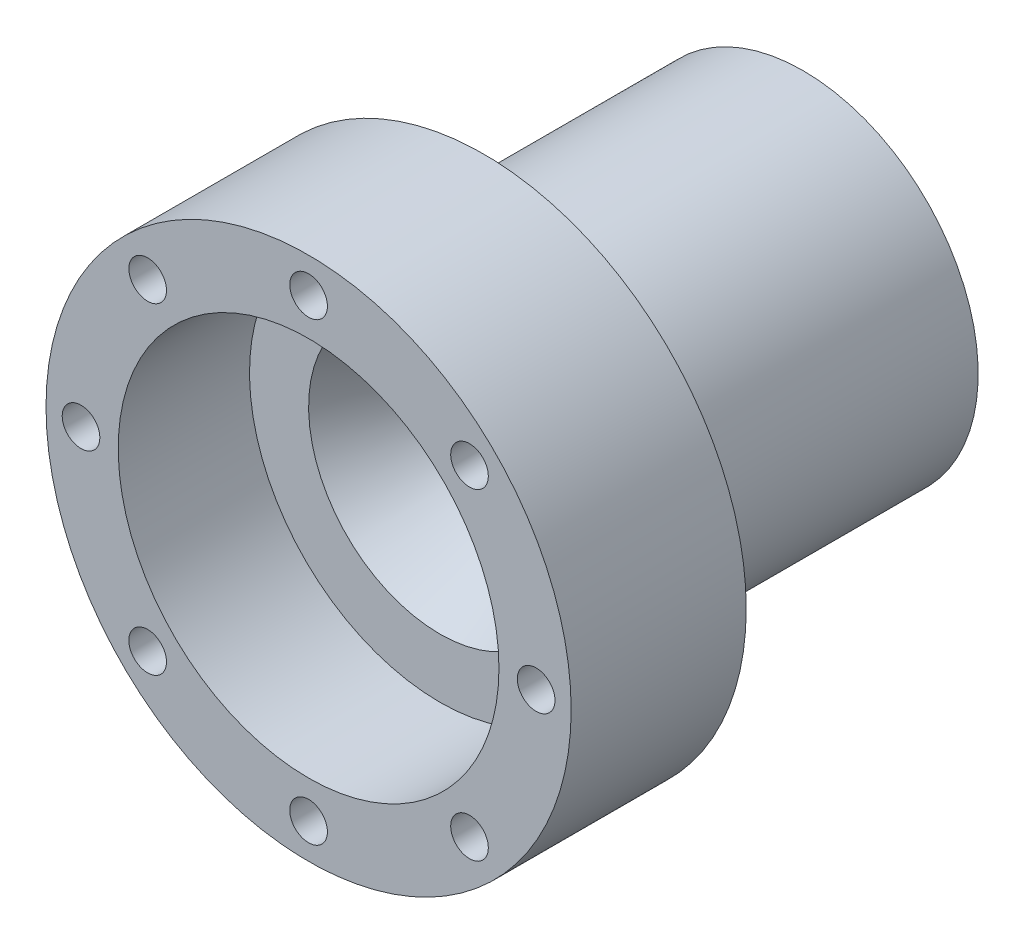
ISO-10303-21;
HEADER;
FILE_DESCRIPTION(('STEP AP214'),'2;1');
FILE_NAME('part.step','',(''),(''),'','','');
FILE_SCHEMA(('AUTOMOTIVE_DESIGN { 1 0 10303 214 1 1 1 1 }'));
ENDSEC;
DATA;
#1=APPLICATION_CONTEXT('core data for automotive mechanical design processes');
#2=APPLICATION_PROTOCOL_DEFINITION('international standard','automotive_design',2000,#1);
#3=PRODUCT_CONTEXT('',#1,'mechanical');
#4=PRODUCT('Part','Part','',(#3));
#5=PRODUCT_RELATED_PRODUCT_CATEGORY('part','',(#4));
#6=PRODUCT_DEFINITION_FORMATION('','',#4);
#7=PRODUCT_DEFINITION_CONTEXT('part definition',#1,'design');
#8=PRODUCT_DEFINITION('design','',#6,#7);
#9=PRODUCT_DEFINITION_SHAPE('','',#8);
#10=(LENGTH_UNIT() NAMED_UNIT(*) SI_UNIT(.MILLI.,.METRE.));
#11=(NAMED_UNIT(*) PLANE_ANGLE_UNIT() SI_UNIT($,.RADIAN.));
#12=(NAMED_UNIT(*) SI_UNIT($,.STERADIAN.) SOLID_ANGLE_UNIT());
#13=UNCERTAINTY_MEASURE_WITH_UNIT(LENGTH_MEASURE(1.E-05),#10,'distance_accuracy_value','');
#14=(GEOMETRIC_REPRESENTATION_CONTEXT(3) GLOBAL_UNCERTAINTY_ASSIGNED_CONTEXT((#13)) GLOBAL_UNIT_ASSIGNED_CONTEXT((#10,
#11,#12)) REPRESENTATION_CONTEXT('',''));
#15=CARTESIAN_POINT('',(0.,0.,0.));
#16=DIRECTION('',(0.,0.,1.));
#17=DIRECTION('',(1.,0.,0.));
#18=AXIS2_PLACEMENT_3D('',#15,#16,#17);
#19=CARTESIAN_POINT('',(0.,0.,15.1713296347436));
#20=DIRECTION('',(0.,0.,1.));
#21=DIRECTION('',(1.,0.,0.));
#22=AXIS2_PLACEMENT_3D('',#19,#20,#21);
#23=PLANE('',#22);
#24=CARTESIAN_POINT('',(18.38477631085,18.3847763108505,15.1713296347436));
#25=DIRECTION('',(0.,0.,-1.));
#26=DIRECTION('',(-1.,0.,0.));
#27=AXIS2_PLACEMENT_3D('',#24,#25,#26);
#28=CIRCLE('',#27,2.15);
#29=CARTESIAN_POINT('',(16.23477631085,18.3847763108505,15.1713296347436));
#30=VERTEX_POINT('',#29);
#31=EDGE_CURVE('E117',#30,#30,#28,.T.);
#32=ORIENTED_EDGE('',*,*,#31,.F.);
#33=EDGE_LOOP('',(#32));
#34=FACE_BOUND('',#33,.T.);
#35=CARTESIAN_POINT('',(-26.,0.,15.1713296347436));
#36=DIRECTION('',(0.,0.,-1.));
#37=DIRECTION('',(-1.,0.,0.));
#38=AXIS2_PLACEMENT_3D('',#35,#36,#37);
#39=CIRCLE('',#38,2.15);
#40=CARTESIAN_POINT('',(-28.15,0.,15.1713296347436));
#41=VERTEX_POINT('',#40);
#42=EDGE_CURVE('E87',#41,#41,#39,.T.);
#43=ORIENTED_EDGE('',*,*,#42,.F.);
#44=EDGE_LOOP('',(#43));
#45=FACE_BOUND('',#44,.T.);
#46=CARTESIAN_POINT('',(-18.3847763108503,18.3847763108502,15.1713296347436));
#47=DIRECTION('',(0.,0.,-1.));
#48=DIRECTION('',(-1.,0.,0.));
#49=AXIS2_PLACEMENT_3D('',#46,#47,#48);
#50=CIRCLE('',#49,2.15);
#51=CARTESIAN_POINT('',(-20.5347763108503,18.3847763108502,15.1713296347436));
#52=VERTEX_POINT('',#51);
#53=EDGE_CURVE('E81',#52,#52,#50,.T.);
#54=ORIENTED_EDGE('',*,*,#53,.F.);
#55=EDGE_LOOP('',(#54));
#56=FACE_BOUND('',#55,.T.);
#57=CARTESIAN_POINT('',(0.,26.,15.1713296347436));
#58=DIRECTION('',(0.,0.,-1.));
#59=DIRECTION('',(-1.,0.,0.));
#60=AXIS2_PLACEMENT_3D('',#57,#58,#59);
#61=CIRCLE('',#60,2.15);
#62=CARTESIAN_POINT('',(-2.15,26.,15.1713296347436));
#63=VERTEX_POINT('',#62);
#64=EDGE_CURVE('E75',#63,#63,#61,.T.);
#65=ORIENTED_EDGE('',*,*,#64,.F.);
#66=EDGE_LOOP('',(#65));
#67=FACE_BOUND('',#66,.T.);
#68=CARTESIAN_POINT('',(0.,0.,15.1713296347436));
#69=DIRECTION('',(0.,0.,1.));
#70=DIRECTION('',(1.,0.,0.));
#71=AXIS2_PLACEMENT_3D('',#68,#69,#70);
#72=CIRCLE('',#71,20.);
#73=CARTESIAN_POINT('',(20.,0.,15.1713296347436));
#74=VERTEX_POINT('',#73);
#75=EDGE_CURVE('E63',#74,#74,#72,.T.);
#76=ORIENTED_EDGE('',*,*,#75,.T.);
#77=EDGE_LOOP('',(#76));
#78=FACE_BOUND('',#77,.T.);
#79=CARTESIAN_POINT('',(0.,0.,15.1713296347436));
#80=DIRECTION('',(0.,0.,1.));
#81=DIRECTION('',(1.,0.,0.));
#82=AXIS2_PLACEMENT_3D('',#79,#80,#81);
#83=CIRCLE('',#82,30.);
#84=CARTESIAN_POINT('',(30.,0.,15.1713296347436));
#85=VERTEX_POINT('',#84);
#86=EDGE_CURVE('E60',#85,#85,#83,.T.);
#87=ORIENTED_EDGE('',*,*,#86,.F.);
#88=EDGE_LOOP('',(#87));
#89=FACE_BOUND('',#88,.T.);
#90=CARTESIAN_POINT('',(-18.3847763108501,-18.3847763108503,15.1713296347436));
#91=DIRECTION('',(0.,0.,-1.));
#92=DIRECTION('',(-1.,0.,0.));
#93=AXIS2_PLACEMENT_3D('',#90,#91,#92);
#94=CIRCLE('',#93,2.15);
#95=CARTESIAN_POINT('',(-20.5347763108501,-18.3847763108503,15.1713296347436));
#96=VERTEX_POINT('',#95);
#97=EDGE_CURVE('E93',#96,#96,#94,.T.);
#98=ORIENTED_EDGE('',*,*,#97,.F.);
#99=EDGE_LOOP('',(#98));
#100=FACE_BOUND('',#99,.T.);
#101=CARTESIAN_POINT('',(0.,-26.,15.1713296347436));
#102=DIRECTION('',(0.,0.,-1.));
#103=DIRECTION('',(-1.,0.,0.));
#104=AXIS2_PLACEMENT_3D('',#101,#102,#103);
#105=CIRCLE('',#104,2.15);
#106=CARTESIAN_POINT('',(-2.15,-26.,15.1713296347436));
#107=VERTEX_POINT('',#106);
#108=EDGE_CURVE('E99',#107,#107,#105,.T.);
#109=ORIENTED_EDGE('',*,*,#108,.F.);
#110=EDGE_LOOP('',(#109));
#111=FACE_BOUND('',#110,.T.);
#112=CARTESIAN_POINT('',(18.3847763108504,-18.3847763108501,15.1713296347436));
#113=DIRECTION('',(0.,0.,-1.));
#114=DIRECTION('',(-1.,0.,0.));
#115=AXIS2_PLACEMENT_3D('',#112,#113,#114);
#116=CIRCLE('',#115,2.15);
#117=CARTESIAN_POINT('',(16.2347763108504,-18.3847763108501,15.1713296347436));
#118=VERTEX_POINT('',#117);
#119=EDGE_CURVE('E105',#118,#118,#116,.T.);
#120=ORIENTED_EDGE('',*,*,#119,.F.);
#121=EDGE_LOOP('',(#120));
#122=FACE_BOUND('',#121,.T.);
#123=CARTESIAN_POINT('',(26.,2.72335544429764E-13,15.1713296347436));
#124=DIRECTION('',(0.,0.,-1.));
#125=DIRECTION('',(-1.,0.,0.));
#126=AXIS2_PLACEMENT_3D('',#123,#124,#125);
#127=CIRCLE('',#126,2.15);
#128=CARTESIAN_POINT('',(23.85,2.72335544429764E-13,15.1713296347436));
#129=VERTEX_POINT('',#128);
#130=EDGE_CURVE('E111',#129,#129,#127,.T.);
#131=ORIENTED_EDGE('',*,*,#130,.F.);
#132=EDGE_LOOP('',(#131));
#133=FACE_BOUND('',#132,.T.);
#134=ADVANCED_FACE('F34',(#34,#45,#56,#67,#78,#89,#100,#111,#122,#133),#23,.F.);
#135=CARTESIAN_POINT('',(0.,15.,20.1713296347436));
#136=DIRECTION('',(0.,0.,1.));
#137=DIRECTION('',(0.,-1.,0.));
#138=AXIS2_PLACEMENT_3D('',#135,#136,#137);
#139=PLANE('',#138);
#140=CARTESIAN_POINT('',(0.,0.,20.1713296347436));
#141=DIRECTION('',(0.,0.,-1.));
#142=DIRECTION('',(0.,1.,0.));
#143=AXIS2_PLACEMENT_3D('',#140,#141,#142);
#144=CIRCLE('',#143,15.);
#145=CARTESIAN_POINT('',(0.,-15.,20.1713296347436));
#146=VERTEX_POINT('',#145);
#147=EDGE_CURVE('E57',#146,#146,#144,.T.);
#148=ORIENTED_EDGE('',*,*,#147,.T.);
#149=EDGE_LOOP('',(#148));
#150=FACE_BOUND('',#149,.T.);
#151=CARTESIAN_POINT('',(0.,0.,20.1713296347436));
#152=DIRECTION('',(0.,0.,1.));
#153=DIRECTION('',(0.,-1.,0.));
#154=AXIS2_PLACEMENT_3D('',#151,#152,#153);
#155=CIRCLE('',#154,21.75);
#156=CARTESIAN_POINT('',(0.,-21.75,20.1713296347436));
#157=VERTEX_POINT('',#156);
#158=EDGE_CURVE('E10',#157,#157,#155,.F.);
#159=ORIENTED_EDGE('',*,*,#158,.F.);
#160=EDGE_LOOP('',(#159));
#161=FACE_BOUND('',#160,.T.);
#162=ADVANCED_FACE('F126',(#150,#161),#139,.T.);
#163=CARTESIAN_POINT('',(0.,0.,0.));
#164=DIRECTION('',(0.,0.,-1.));
#165=DIRECTION('',(0.,1.,0.));
#166=AXIS2_PLACEMENT_3D('',#163,#164,#165);
#167=CYLINDRICAL_SURFACE('',#166,20.);
#168=CARTESIAN_POINT('',(0.,0.,-21.3286703652564));
#169=DIRECTION('',(0.,0.,-1.));
#170=DIRECTION('',(0.,1.,0.));
#171=AXIS2_PLACEMENT_3D('',#168,#169,#170);
#172=CIRCLE('',#171,20.);
#173=CARTESIAN_POINT('',(0.,20.,-21.3286703652564));
#174=VERTEX_POINT('',#173);
#175=EDGE_CURVE('E41',#174,#174,#172,.T.);
#176=ORIENTED_EDGE('',*,*,#175,.F.);
#177=EDGE_LOOP('',(#176));
#178=FACE_BOUND('',#177,.T.);
#179=ORIENTED_EDGE('',*,*,#75,.F.);
#180=EDGE_LOOP('',(#179));
#181=FACE_BOUND('',#180,.T.);
#182=ADVANCED_FACE('F36',(#178,#181),#167,.T.);
#183=CARTESIAN_POINT('',(0.,20.,-21.3286703652564));
#184=DIRECTION('',(0.,0.,-1.));
#185=DIRECTION('',(0.,1.,0.));
#186=AXIS2_PLACEMENT_3D('',#183,#184,#185);
#187=PLANE('',#186);
#188=ORIENTED_EDGE('',*,*,#175,.T.);
#189=EDGE_LOOP('',(#188));
#190=FACE_BOUND('',#189,.T.);
#191=CARTESIAN_POINT('',(0.,0.,-21.3286703652564));
#192=DIRECTION('',(0.,0.,-1.));
#193=DIRECTION('',(0.,1.,0.));
#194=AXIS2_PLACEMENT_3D('',#191,#192,#193);
#195=CIRCLE('',#194,10.285);
#196=CARTESIAN_POINT('',(0.,10.285,-21.3286703652564));
#197=VERTEX_POINT('',#196);
#198=EDGE_CURVE('E45',#197,#197,#195,.T.);
#199=ORIENTED_EDGE('',*,*,#198,.F.);
#200=EDGE_LOOP('',(#199));
#201=FACE_BOUND('',#200,.T.);
#202=ADVANCED_FACE('F203',(#190,#201),#187,.T.);
#203=CARTESIAN_POINT('',(0.,0.,0.));
#204=DIRECTION('',(0.,0.,-1.));
#205=DIRECTION('',(0.,1.,0.));
#206=AXIS2_PLACEMENT_3D('',#203,#204,#205);
#207=CONICAL_SURFACE('',#206,4.57,0.261799387799147);
#208=ORIENTED_EDGE('',*,*,#198,.T.);
#209=EDGE_LOOP('',(#208));
#210=FACE_BOUND('',#209,.T.);
#211=CARTESIAN_POINT('',(0.,0.,0.));
#212=DIRECTION('',(0.,0.,-1.));
#213=DIRECTION('',(0.,1.,0.));
#214=AXIS2_PLACEMENT_3D('',#211,#212,#213);
#215=CIRCLE('',#214,4.57);
#216=CARTESIAN_POINT('',(0.,4.57,0.));
#217=VERTEX_POINT('',#216);
#218=EDGE_CURVE('E49',#217,#217,#215,.T.);
#219=ORIENTED_EDGE('',*,*,#218,.F.);
#220=EDGE_LOOP('',(#219));
#221=FACE_BOUND('',#220,.T.);
#222=ADVANCED_FACE('F200',(#210,#221),#207,.F.);
#223=CARTESIAN_POINT('',(0.,0.,0.));
#224=DIRECTION('',(0.,0.,-1.));
#225=DIRECTION('',(0.,1.,0.));
#226=AXIS2_PLACEMENT_3D('',#223,#224,#225);
#227=CYLINDRICAL_SURFACE('',#226,4.57);
#228=ORIENTED_EDGE('',*,*,#218,.T.);
#229=EDGE_LOOP('',(#228));
#230=FACE_BOUND('',#229,.T.);
#231=CARTESIAN_POINT('',(0.,0.,2.10603971180046));
#232=DIRECTION('',(0.,0.,-1.));
#233=DIRECTION('',(0.,1.,0.));
#234=AXIS2_PLACEMENT_3D('',#231,#232,#233);
#235=CIRCLE('',#234,4.57);
#236=CARTESIAN_POINT('',(0.,-4.57,2.10603971180046));
#237=VERTEX_POINT('',#236);
#238=EDGE_CURVE('E54',#237,#237,#235,.T.);
#239=ORIENTED_EDGE('',*,*,#238,.F.);
#240=EDGE_LOOP('',(#239));
#241=FACE_BOUND('',#240,.T.);
#242=ADVANCED_FACE('F196',(#230,#241),#227,.F.);
#243=CARTESIAN_POINT('',(0.,0.,20.1713296347436));
#244=DIRECTION('',(0.,0.,1.));
#245=DIRECTION('',(0.,-1.,0.));
#246=AXIS2_PLACEMENT_3D('',#243,#244,#245);
#247=CONICAL_SURFACE('',#246,15.,0.523598775598304);
#248=CARTESIAN_POINT('',(0.,-4.57,2.10603971180046));
#249=CARTESIAN_POINT('',(0.,-4.67864583333333,2.29421981516445));
#250=CARTESIAN_POINT('',(0.,-4.78729166666667,2.48239991852844));
#251=CARTESIAN_POINT('',(0.,-5.00458333333333,2.85876012525643));
#252=CARTESIAN_POINT('',(0.,-5.11322916666667,3.04694022862042));
#253=CARTESIAN_POINT('',(0.,-5.33052083333333,3.4233004353484));
#254=CARTESIAN_POINT('',(0.,-5.43916666666667,3.61148053871239));
#255=CARTESIAN_POINT('',(0.,-5.65645833333333,3.98784074544037));
#256=CARTESIAN_POINT('',(0.,-5.76510416666667,4.17602084880436));
#257=CARTESIAN_POINT('',(0.,-5.98239583333333,4.55238105553235));
#258=CARTESIAN_POINT('',(0.,-6.09104166666667,4.74056115889634));
#259=CARTESIAN_POINT('',(0.,-6.30833333333334,5.11692136562432));
#260=CARTESIAN_POINT('',(0.,-6.41697916666667,5.30510146898832));
#261=CARTESIAN_POINT('',(0.,-6.63427083333333,5.6814616757163));
#262=CARTESIAN_POINT('',(0.,-6.74291666666667,5.86964177908029));
#263=CARTESIAN_POINT('',(0.,-6.96020833333333,6.24600198580827));
#264=CARTESIAN_POINT('',(0.,-7.06885416666667,6.43418208917226));
#265=CARTESIAN_POINT('',(0.,-7.28614583333333,6.81054229590025));
#266=CARTESIAN_POINT('',(0.,-7.39479166666667,6.99872239926424));
#267=CARTESIAN_POINT('',(0.,-7.61208333333333,7.37508260599222));
#268=CARTESIAN_POINT('',(0.,-7.72072916666667,7.56326270935621));
#269=CARTESIAN_POINT('',(0.,-7.93802083333333,7.9396229160842));
#270=CARTESIAN_POINT('',(0.,-8.04666666666667,8.12780301944819));
#271=CARTESIAN_POINT('',(0.,-8.26395833333333,8.50416322617617));
#272=CARTESIAN_POINT('',(0.,-8.37260416666667,8.69234332954017));
#273=CARTESIAN_POINT('',(0.,-8.58989583333333,9.06870353626815));
#274=CARTESIAN_POINT('',(0.,-8.69854166666667,9.25688363963214));
#275=CARTESIAN_POINT('',(0.,-8.91583333333334,9.63324384636012));
#276=CARTESIAN_POINT('',(0.,-9.02447916666667,9.82142394972411));
#277=CARTESIAN_POINT('',(0.,-9.24177083333333,10.1977841564521));
#278=CARTESIAN_POINT('',(0.,-9.35041666666667,10.3859642598161));
#279=CARTESIAN_POINT('',(0.,-9.56770833333333,10.7623244665441));
#280=CARTESIAN_POINT('',(0.,-9.67635416666666,10.9505045699081));
#281=CARTESIAN_POINT('',(0.,-9.89364583333333,11.326864776636));
#282=CARTESIAN_POINT('',(0.,-10.0022916666667,11.51504488));
#283=CARTESIAN_POINT('',(0.,-10.2195833333333,11.891405086728));
#284=CARTESIAN_POINT('',(0.,-10.3282291666667,12.079585190092));
#285=CARTESIAN_POINT('',(0.,-10.5455208333333,12.45594539682));
#286=CARTESIAN_POINT('',(0.,-10.6541666666667,12.644125500184));
#287=CARTESIAN_POINT('',(0.,-10.8714583333333,13.020485706912));
#288=CARTESIAN_POINT('',(0.,-10.9801041666667,13.208665810276));
#289=CARTESIAN_POINT('',(0.,-11.1973958333333,13.5850260170039));
#290=CARTESIAN_POINT('',(0.,-11.3060416666667,13.7732061203679));
#291=CARTESIAN_POINT('',(0.,-11.5233333333333,14.1495663270959));
#292=CARTESIAN_POINT('',(0.,-11.6319791666667,14.3377464304599));
#293=CARTESIAN_POINT('',(0.,-11.8492708333333,14.7141066371879));
#294=CARTESIAN_POINT('',(0.,-11.9579166666667,14.9022867405519));
#295=CARTESIAN_POINT('',(0.,-12.1752083333333,15.2786469472799));
#296=CARTESIAN_POINT('',(0.,-12.2838541666667,15.4668270506439));
#297=CARTESIAN_POINT('',(0.,-12.5011458333333,15.8431872573718));
#298=CARTESIAN_POINT('',(0.,-12.6097916666667,16.0313673607358));
#299=CARTESIAN_POINT('',(0.,-12.8270833333333,16.4077275674638));
#300=CARTESIAN_POINT('',(0.,-12.9357291666667,16.5959076708278));
#301=CARTESIAN_POINT('',(0.,-13.1530208333333,16.9722678775558));
#302=CARTESIAN_POINT('',(0.,-13.2616666666667,17.1604479809198));
#303=CARTESIAN_POINT('',(0.,-13.4789583333333,17.5368081876478));
#304=CARTESIAN_POINT('',(0.,-13.5876041666667,17.7249882910118));
#305=CARTESIAN_POINT('',(0.,-13.8048958333333,18.1013484977397));
#306=CARTESIAN_POINT('',(0.,-13.9135416666667,18.2895286011037));
#307=CARTESIAN_POINT('',(0.,-14.1308333333333,18.6658888078317));
#308=CARTESIAN_POINT('',(0.,-14.2394791666667,18.8540689111957));
#309=CARTESIAN_POINT('',(0.,-14.4567708333333,19.2304291179237));
#310=CARTESIAN_POINT('',(0.,-14.5654166666667,19.4186092212877));
#311=CARTESIAN_POINT('',(0.,-14.7827083333333,19.7949694280157));
#312=CARTESIAN_POINT('',(0.,-14.8913541666667,19.9831495313797));
#313=CARTESIAN_POINT('',(0.,-15.,20.1713296347436));
#314=B_SPLINE_CURVE_WITH_KNOTS('',3,(#248,#249,#250,#251,#252,#253,#254,#255,#256,#257,#258,
#259,#260,#261,#262,#263,#264,#265,#266,#267,#268,#269,#270,#271,#272,#273,#274,#275,#276,#277,
#278,#279,#280,#281,#282,#283,#284,#285,#286,#287,#288,#289,#290,#291,#292,#293,#294,#295,#296,
#297,#298,#299,#300,#301,#302,#303,#304,#305,#306,#307,#308,#309,#310,#311,#312,#313),
.UNSPECIFIED.,.F.,.F.,(4,2,2,2,2,2,2,2,2,2,2,2,2,2,2,2,2,2,2,2,2,2,2,2,2,2,2,2,2,2,2,2,4),(0.,
0.651874999999996,1.30374999999999,1.95562499999998,2.60749999999998,3.25937499999997,
3.91124999999997,4.56312499999996,5.21499999999996,5.86687499999995,6.51874999999994,
7.17062499999994,7.82249999999994,8.47437499999993,9.12624999999992,9.77812499999992,
10.4299999999999,11.0818749999999,11.7337499999999,12.3856249999999,13.0374999999999,
13.6893749999999,14.3412499999999,14.9931249999999,15.6449999999999,16.2968749999999,
16.9487499999999,17.6006249999999,18.2524999999998,18.9043749999998,19.5562499999998,
20.2081249999998,20.8599999999998),.UNSPECIFIED.);
#315=EDGE_CURVE('BSEAM189',#237,#146,#314,.T.);
#316=ORIENTED_EDGE('',*,*,#238,.T.);
#317=ORIENTED_EDGE('',*,*,#147,.F.);
#318=ORIENTED_EDGE('',*,*,#315,.T.);
#319=ORIENTED_EDGE('',*,*,#315,.F.);
#320=EDGE_LOOP('',(#316,#318,#317,#319));
#321=FACE_BOUND('',#320,.T.);
#322=ADVANCED_FACE('F189',(#321),#247,.F.);
#323=CARTESIAN_POINT('',(0.,0.,15.1713296347436));
#324=DIRECTION('',(0.,0.,1.));
#325=DIRECTION('',(1.,0.,0.));
#326=AXIS2_PLACEMENT_3D('',#323,#324,#325);
#327=CYLINDRICAL_SURFACE('',#326,30.);
#328=ORIENTED_EDGE('',*,*,#86,.T.);
#329=EDGE_LOOP('',(#328));
#330=FACE_BOUND('',#329,.T.);
#331=CARTESIAN_POINT('',(0.,0.,35.1713296347436));
#332=DIRECTION('',(0.,0.,1.));
#333=DIRECTION('',(1.,0.,0.));
#334=AXIS2_PLACEMENT_3D('',#331,#332,#333);
#335=CIRCLE('',#334,30.);
#336=CARTESIAN_POINT('',(30.,0.,35.1713296347436));
#337=VERTEX_POINT('',#336);
#338=EDGE_CURVE('E66',#337,#337,#335,.T.);
#339=ORIENTED_EDGE('',*,*,#338,.F.);
#340=EDGE_LOOP('',(#339));
#341=FACE_BOUND('',#340,.T.);
#342=ADVANCED_FACE('F157',(#330,#341),#327,.T.);
#343=CARTESIAN_POINT('',(0.,0.,35.1713296347436));
#344=DIRECTION('',(0.,0.,1.));
#345=DIRECTION('',(1.,0.,0.));
#346=AXIS2_PLACEMENT_3D('',#343,#344,#345);
#347=PLANE('',#346);
#348=CARTESIAN_POINT('',(18.38477631085,18.3847763108505,35.1713296347436));
#349=DIRECTION('',(0.,0.,1.));
#350=DIRECTION('',(1.,0.,0.));
#351=AXIS2_PLACEMENT_3D('',#348,#349,#350);
#352=CIRCLE('',#351,2.15);
#353=CARTESIAN_POINT('',(20.53477631085,18.3847763108505,35.1713296347436));
#354=VERTEX_POINT('',#353);
#355=EDGE_CURVE('E114',#354,#354,#352,.T.);
#356=ORIENTED_EDGE('',*,*,#355,.F.);
#357=EDGE_LOOP('',(#356));
#358=FACE_BOUND('',#357,.T.);
#359=CARTESIAN_POINT('',(26.,2.72335544429764E-13,35.1713296347436));
#360=DIRECTION('',(0.,0.,1.));
#361=DIRECTION('',(1.,0.,0.));
#362=AXIS2_PLACEMENT_3D('',#359,#360,#361);
#363=CIRCLE('',#362,2.15);
#364=CARTESIAN_POINT('',(28.15,2.72335544429764E-13,35.1713296347436));
#365=VERTEX_POINT('',#364);
#366=EDGE_CURVE('E108',#365,#365,#363,.T.);
#367=ORIENTED_EDGE('',*,*,#366,.F.);
#368=EDGE_LOOP('',(#367));
#369=FACE_BOUND('',#368,.T.);
#370=CARTESIAN_POINT('',(18.3847763108504,-18.3847763108501,35.1713296347436));
#371=DIRECTION('',(0.,0.,1.));
#372=DIRECTION('',(1.,0.,0.));
#373=AXIS2_PLACEMENT_3D('',#370,#371,#372);
#374=CIRCLE('',#373,2.15);
#375=CARTESIAN_POINT('',(20.5347763108504,-18.3847763108501,35.1713296347436));
#376=VERTEX_POINT('',#375);
#377=EDGE_CURVE('E102',#376,#376,#374,.T.);
#378=ORIENTED_EDGE('',*,*,#377,.F.);
#379=EDGE_LOOP('',(#378));
#380=FACE_BOUND('',#379,.T.);
#381=CARTESIAN_POINT('',(0.,-26.,35.1713296347436));
#382=DIRECTION('',(0.,0.,1.));
#383=DIRECTION('',(1.,0.,0.));
#384=AXIS2_PLACEMENT_3D('',#381,#382,#383);
#385=CIRCLE('',#384,2.15);
#386=CARTESIAN_POINT('',(2.15,-26.,35.1713296347436));
#387=VERTEX_POINT('',#386);
#388=EDGE_CURVE('E96',#387,#387,#385,.T.);
#389=ORIENTED_EDGE('',*,*,#388,.F.);
#390=EDGE_LOOP('',(#389));
#391=FACE_BOUND('',#390,.T.);
#392=CARTESIAN_POINT('',(-18.3847763108501,-18.3847763108503,35.1713296347436));
#393=DIRECTION('',(0.,0.,1.));
#394=DIRECTION('',(1.,0.,0.));
#395=AXIS2_PLACEMENT_3D('',#392,#393,#394);
#396=CIRCLE('',#395,2.15);
#397=CARTESIAN_POINT('',(-16.2347763108501,-18.3847763108503,35.1713296347436));
#398=VERTEX_POINT('',#397);
#399=EDGE_CURVE('E90',#398,#398,#396,.T.);
#400=ORIENTED_EDGE('',*,*,#399,.F.);
#401=EDGE_LOOP('',(#400));
#402=FACE_BOUND('',#401,.T.);
#403=CARTESIAN_POINT('',(-26.,0.,35.1713296347436));
#404=DIRECTION('',(0.,0.,1.));
#405=DIRECTION('',(1.,0.,0.));
#406=AXIS2_PLACEMENT_3D('',#403,#404,#405);
#407=CIRCLE('',#406,2.15);
#408=CARTESIAN_POINT('',(-23.85,0.,35.1713296347436));
#409=VERTEX_POINT('',#408);
#410=EDGE_CURVE('E84',#409,#409,#407,.T.);
#411=ORIENTED_EDGE('',*,*,#410,.F.);
#412=EDGE_LOOP('',(#411));
#413=FACE_BOUND('',#412,.T.);
#414=CARTESIAN_POINT('',(-18.3847763108503,18.3847763108502,35.1713296347436));
#415=DIRECTION('',(0.,0.,1.));
#416=DIRECTION('',(1.,0.,0.));
#417=AXIS2_PLACEMENT_3D('',#414,#415,#416);
#418=CIRCLE('',#417,2.15);
#419=CARTESIAN_POINT('',(-16.2347763108503,18.3847763108502,35.1713296347436));
#420=VERTEX_POINT('',#419);
#421=EDGE_CURVE('E78',#420,#420,#418,.T.);
#422=ORIENTED_EDGE('',*,*,#421,.F.);
#423=EDGE_LOOP('',(#422));
#424=FACE_BOUND('',#423,.T.);
#425=CARTESIAN_POINT('',(0.,26.,35.1713296347436));
#426=DIRECTION('',(0.,0.,1.));
#427=DIRECTION('',(1.,0.,0.));
#428=AXIS2_PLACEMENT_3D('',#425,#426,#427);
#429=CIRCLE('',#428,2.15);
#430=CARTESIAN_POINT('',(2.15,26.,35.1713296347436));
#431=VERTEX_POINT('',#430);
#432=EDGE_CURVE('E72',#431,#431,#429,.T.);
#433=ORIENTED_EDGE('',*,*,#432,.F.);
#434=EDGE_LOOP('',(#433));
#435=FACE_BOUND('',#434,.T.);
#436=ORIENTED_EDGE('',*,*,#338,.T.);
#437=EDGE_LOOP('',(#436));
#438=FACE_BOUND('',#437,.T.);
#439=CARTESIAN_POINT('',(0.,0.,35.1713296347436));
#440=DIRECTION('',(0.,0.,1.));
#441=DIRECTION('',(1.,0.,0.));
#442=AXIS2_PLACEMENT_3D('',#439,#440,#441);
#443=CIRCLE('',#442,21.75);
#444=CARTESIAN_POINT('',(21.75,0.,35.1713296347436));
#445=VERTEX_POINT('',#444);
#446=EDGE_CURVE('E69',#445,#445,#443,.T.);
#447=ORIENTED_EDGE('',*,*,#446,.F.);
#448=EDGE_LOOP('',(#447));
#449=FACE_BOUND('',#448,.T.);
#450=ADVANCED_FACE('F153',(#358,#369,#380,#391,#402,#413,#424,#435,#438,#449),#347,.T.);
#451=CARTESIAN_POINT('',(0.,0.,35.1713296347436));
#452=DIRECTION('',(0.,0.,-1.));
#453=DIRECTION('',(-1.,0.,0.));
#454=AXIS2_PLACEMENT_3D('',#451,#452,#453);
#455=CYLINDRICAL_SURFACE('',#454,21.75);
#456=ORIENTED_EDGE('',*,*,#446,.T.);
#457=EDGE_LOOP('',(#456));
#458=FACE_BOUND('',#457,.T.);
#459=ORIENTED_EDGE('',*,*,#158,.T.);
#460=EDGE_LOOP('',(#459));
#461=FACE_BOUND('',#460,.T.);
#462=ADVANCED_FACE('F156',(#458,#461),#455,.F.);
#463=CARTESIAN_POINT('',(0.,26.,15.1713296347436));
#464=DIRECTION('',(0.,0.,-1.));
#465=DIRECTION('',(-1.,0.,0.));
#466=AXIS2_PLACEMENT_3D('',#463,#464,#465);
#467=CYLINDRICAL_SURFACE('',#466,2.15);
#468=ORIENTED_EDGE('',*,*,#64,.T.);
#469=EDGE_LOOP('',(#468));
#470=FACE_BOUND('',#469,.T.);
#471=ORIENTED_EDGE('',*,*,#432,.T.);
#472=EDGE_LOOP('',(#471));
#473=FACE_BOUND('',#472,.T.);
#474=ADVANCED_FACE('F177',(#470,#473),#467,.F.);
#475=CARTESIAN_POINT('',(-18.3847763108503,18.3847763108502,15.1713296347436));
#476=DIRECTION('',(0.,0.,-1.));
#477=DIRECTION('',(-1.,0.,0.));
#478=AXIS2_PLACEMENT_3D('',#475,#476,#477);
#479=CYLINDRICAL_SURFACE('',#478,2.15);
#480=ORIENTED_EDGE('',*,*,#53,.T.);
#481=EDGE_LOOP('',(#480));
#482=FACE_BOUND('',#481,.T.);
#483=ORIENTED_EDGE('',*,*,#421,.T.);
#484=EDGE_LOOP('',(#483));
#485=FACE_BOUND('',#484,.T.);
#486=ADVANCED_FACE('F182',(#482,#485),#479,.F.);
#487=CARTESIAN_POINT('',(-26.,0.,15.1713296347436));
#488=DIRECTION('',(0.,0.,-1.));
#489=DIRECTION('',(-1.,0.,0.));
#490=AXIS2_PLACEMENT_3D('',#487,#488,#489);
#491=CYLINDRICAL_SURFACE('',#490,2.15);
#492=ORIENTED_EDGE('',*,*,#42,.T.);
#493=EDGE_LOOP('',(#492));
#494=FACE_BOUND('',#493,.T.);
#495=ORIENTED_EDGE('',*,*,#410,.T.);
#496=EDGE_LOOP('',(#495));
#497=FACE_BOUND('',#496,.T.);
#498=ADVANCED_FACE('F254',(#494,#497),#491,.F.);
#499=CARTESIAN_POINT('',(-18.3847763108501,-18.3847763108503,15.1713296347436));
#500=DIRECTION('',(0.,0.,-1.));
#501=DIRECTION('',(-1.,0.,0.));
#502=AXIS2_PLACEMENT_3D('',#499,#500,#501);
#503=CYLINDRICAL_SURFACE('',#502,2.15);
#504=ORIENTED_EDGE('',*,*,#97,.T.);
#505=EDGE_LOOP('',(#504));
#506=FACE_BOUND('',#505,.T.);
#507=ORIENTED_EDGE('',*,*,#399,.T.);
#508=EDGE_LOOP('',(#507));
#509=FACE_BOUND('',#508,.T.);
#510=ADVANCED_FACE('F264',(#506,#509),#503,.F.);
#511=CARTESIAN_POINT('',(0.,-26.,15.1713296347436));
#512=DIRECTION('',(0.,0.,-1.));
#513=DIRECTION('',(-1.,0.,0.));
#514=AXIS2_PLACEMENT_3D('',#511,#512,#513);
#515=CYLINDRICAL_SURFACE('',#514,2.15);
#516=ORIENTED_EDGE('',*,*,#108,.T.);
#517=EDGE_LOOP('',(#516));
#518=FACE_BOUND('',#517,.T.);
#519=ORIENTED_EDGE('',*,*,#388,.T.);
#520=EDGE_LOOP('',(#519));
#521=FACE_BOUND('',#520,.T.);
#522=ADVANCED_FACE('F275',(#518,#521),#515,.F.);
#523=CARTESIAN_POINT('',(18.3847763108504,-18.3847763108501,15.1713296347436));
#524=DIRECTION('',(0.,0.,-1.));
#525=DIRECTION('',(-1.,0.,0.));
#526=AXIS2_PLACEMENT_3D('',#523,#524,#525);
#527=CYLINDRICAL_SURFACE('',#526,2.15);
#528=ORIENTED_EDGE('',*,*,#119,.T.);
#529=EDGE_LOOP('',(#528));
#530=FACE_BOUND('',#529,.T.);
#531=ORIENTED_EDGE('',*,*,#377,.T.);
#532=EDGE_LOOP('',(#531));
#533=FACE_BOUND('',#532,.T.);
#534=ADVANCED_FACE('F149',(#530,#533),#527,.F.);
#535=CARTESIAN_POINT('',(26.,2.72335544429764E-13,15.1713296347436));
#536=DIRECTION('',(0.,0.,-1.));
#537=DIRECTION('',(-1.,0.,0.));
#538=AXIS2_PLACEMENT_3D('',#535,#536,#537);
#539=CYLINDRICAL_SURFACE('',#538,2.15);
#540=ORIENTED_EDGE('',*,*,#130,.T.);
#541=EDGE_LOOP('',(#540));
#542=FACE_BOUND('',#541,.T.);
#543=ORIENTED_EDGE('',*,*,#366,.T.);
#544=EDGE_LOOP('',(#543));
#545=FACE_BOUND('',#544,.T.);
#546=ADVANCED_FACE('F146',(#542,#545),#539,.F.);
#547=CARTESIAN_POINT('',(18.38477631085,18.3847763108505,15.1713296347436));
#548=DIRECTION('',(0.,0.,-1.));
#549=DIRECTION('',(-1.,0.,0.));
#550=AXIS2_PLACEMENT_3D('',#547,#548,#549);
#551=CYLINDRICAL_SURFACE('',#550,2.15);
#552=ORIENTED_EDGE('',*,*,#31,.T.);
#553=EDGE_LOOP('',(#552));
#554=FACE_BOUND('',#553,.T.);
#555=ORIENTED_EDGE('',*,*,#355,.T.);
#556=EDGE_LOOP('',(#555));
#557=FACE_BOUND('',#556,.T.);
#558=ADVANCED_FACE('F121',(#554,#557),#551,.F.);
#559=CLOSED_SHELL('',(#134,#162,#182,#202,#222,#242,#322,#342,#450,#462,#474,#486,#498,#510,
#522,#534,#546,#558));
#560=MANIFOLD_SOLID_BREP('B2',#559);
#561=ADVANCED_BREP_SHAPE_REPRESENTATION('',(#18,#560),#14);
#562=SHAPE_DEFINITION_REPRESENTATION(#9,#561);
ENDSEC;
END-ISO-10303-21;
